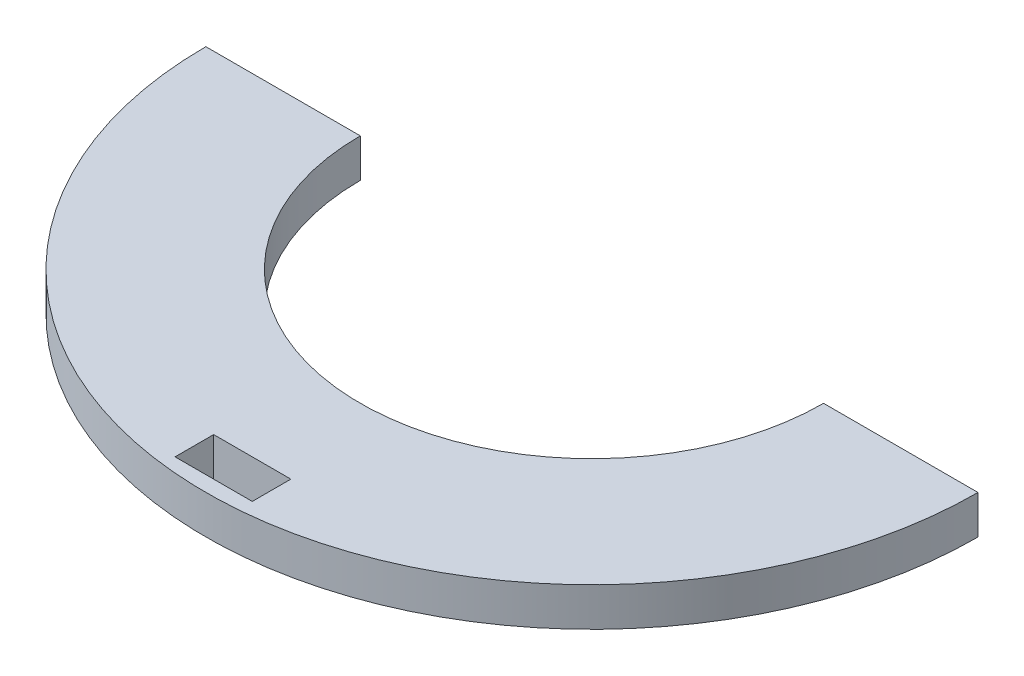
ISO-10303-21;
HEADER;
FILE_DESCRIPTION(('STEP AP214'),'2;1');
FILE_NAME('part.step','',(''),(''),'','','');
FILE_SCHEMA(('AUTOMOTIVE_DESIGN { 1 0 10303 214 1 1 1 1 }'));
ENDSEC;
DATA;
#1=APPLICATION_CONTEXT('core data for automotive mechanical design processes');
#2=APPLICATION_PROTOCOL_DEFINITION('international standard','automotive_design',2000,#1);
#3=PRODUCT_CONTEXT('',#1,'mechanical');
#4=PRODUCT('Part','Part','',(#3));
#5=PRODUCT_RELATED_PRODUCT_CATEGORY('part','',(#4));
#6=PRODUCT_DEFINITION_FORMATION('','',#4);
#7=PRODUCT_DEFINITION_CONTEXT('part definition',#1,'design');
#8=PRODUCT_DEFINITION('design','',#6,#7);
#9=PRODUCT_DEFINITION_SHAPE('','',#8);
#10=(LENGTH_UNIT() NAMED_UNIT(*) SI_UNIT(.MILLI.,.METRE.));
#11=(NAMED_UNIT(*) PLANE_ANGLE_UNIT() SI_UNIT($,.RADIAN.));
#12=(NAMED_UNIT(*) SI_UNIT($,.STERADIAN.) SOLID_ANGLE_UNIT());
#13=UNCERTAINTY_MEASURE_WITH_UNIT(LENGTH_MEASURE(1.E-05),#10,'distance_accuracy_value','');
#14=(GEOMETRIC_REPRESENTATION_CONTEXT(3) GLOBAL_UNCERTAINTY_ASSIGNED_CONTEXT((#13)) GLOBAL_UNIT_ASSIGNED_CONTEXT((#10,
#11,#12)) REPRESENTATION_CONTEXT('',''));
#15=CARTESIAN_POINT('',(0.,0.,0.));
#16=DIRECTION('',(0.,0.,1.));
#17=DIRECTION('',(1.,0.,0.));
#18=AXIS2_PLACEMENT_3D('',#15,#16,#17);
#19=CARTESIAN_POINT('',(0.,5.,0.));
#20=DIRECTION('',(0.,-1.,0.));
#21=DIRECTION('',(0.,0.,-1.));
#22=AXIS2_PLACEMENT_3D('',#19,#20,#21);
#23=CYLINDRICAL_SURFACE('',#22,30.);
#24=CARTESIAN_POINT('',(0.,0.,0.));
#25=DIRECTION('',(0.,-1.,0.));
#26=DIRECTION('',(0.,0.,1.));
#27=AXIS2_PLACEMENT_3D('',#24,#25,#26);
#28=CIRCLE('',#27,30.);
#29=CARTESIAN_POINT('',(30.,0.,0.));
#30=VERTEX_POINT('',#29);
#31=CARTESIAN_POINT('',(-30.,0.,0.));
#32=VERTEX_POINT('',#31);
#33=EDGE_CURVE('E127',#30,#32,#28,.T.);
#34=ORIENTED_EDGE('',*,*,#33,.T.);
#35=DIRECTION('',(0.,-1.,0.));
#36=VECTOR('',#35,1.);
#37=CARTESIAN_POINT('',(-30.,5.,0.));
#38=LINE('',#37,#36);
#39=CARTESIAN_POINT('',(-30.,5.,0.));
#40=VERTEX_POINT('',#39);
#41=EDGE_CURVE('E156',#40,#32,#38,.T.);
#42=ORIENTED_EDGE('',*,*,#41,.F.);
#43=CARTESIAN_POINT('',(0.,5.,0.));
#44=DIRECTION('',(0.,-1.,0.));
#45=DIRECTION('',(0.,0.,1.));
#46=AXIS2_PLACEMENT_3D('',#43,#44,#45);
#47=CIRCLE('',#46,30.);
#48=CARTESIAN_POINT('',(30.,5.,0.));
#49=VERTEX_POINT('',#48);
#50=EDGE_CURVE('E130',#49,#40,#47,.T.);
#51=ORIENTED_EDGE('',*,*,#50,.F.);
#52=DIRECTION('',(0.,-1.,0.));
#53=VECTOR('',#52,1.);
#54=CARTESIAN_POINT('',(30.,5.,0.));
#55=LINE('',#54,#53);
#56=EDGE_CURVE('E140',#49,#30,#55,.T.);
#57=ORIENTED_EDGE('',*,*,#56,.T.);
#58=EDGE_LOOP('',(#34,#42,#51,#57));
#59=FACE_BOUND('',#58,.T.);
#60=ADVANCED_FACE('F37',(#59),#23,.F.);
#61=CARTESIAN_POINT('',(-30.,5.,0.));
#62=DIRECTION('',(0.,0.,1.));
#63=DIRECTION('',(1.,0.,0.));
#64=AXIS2_PLACEMENT_3D('',#61,#62,#63);
#65=PLANE('',#64);
#66=DIRECTION('',(-1.,0.,0.));
#67=VECTOR('',#66,1.);
#68=CARTESIAN_POINT('',(-30.,0.,0.));
#69=LINE('',#68,#67);
#70=CARTESIAN_POINT('',(-50.,0.,0.));
#71=VERTEX_POINT('',#70);
#72=EDGE_CURVE('E143',#32,#71,#69,.T.);
#73=ORIENTED_EDGE('',*,*,#72,.T.);
#74=DIRECTION('',(0.,-1.,0.));
#75=VECTOR('',#74,1.);
#76=CARTESIAN_POINT('',(-50.,5.,0.));
#77=LINE('',#76,#75);
#78=CARTESIAN_POINT('',(-50.,5.,0.));
#79=VERTEX_POINT('',#78);
#80=EDGE_CURVE('E153',#79,#71,#77,.T.);
#81=ORIENTED_EDGE('',*,*,#80,.F.);
#82=DIRECTION('',(-1.,0.,0.));
#83=VECTOR('',#82,1.);
#84=CARTESIAN_POINT('',(-30.,5.,0.));
#85=LINE('',#84,#83);
#86=EDGE_CURVE('E133',#40,#79,#85,.T.);
#87=ORIENTED_EDGE('',*,*,#86,.F.);
#88=ORIENTED_EDGE('',*,*,#41,.T.);
#89=EDGE_LOOP('',(#73,#81,#87,#88));
#90=FACE_BOUND('',#89,.T.);
#91=ADVANCED_FACE('F180',(#90),#65,.F.);
#92=CARTESIAN_POINT('',(0.,5.,0.));
#93=DIRECTION('',(0.,-1.,0.));
#94=DIRECTION('',(0.,0.,-1.));
#95=AXIS2_PLACEMENT_3D('',#92,#93,#94);
#96=CYLINDRICAL_SURFACE('',#95,50.);
#97=CARTESIAN_POINT('',(0.,0.,0.));
#98=DIRECTION('',(0.,1.,0.));
#99=DIRECTION('',(0.,0.,1.));
#100=AXIS2_PLACEMENT_3D('',#97,#98,#99);
#101=CIRCLE('',#100,50.);
#102=CARTESIAN_POINT('',(50.,0.,0.));
#103=VERTEX_POINT('',#102);
#104=EDGE_CURVE('E145',#71,#103,#101,.T.);
#105=ORIENTED_EDGE('',*,*,#104,.T.);
#106=DIRECTION('',(0.,-1.,0.));
#107=VECTOR('',#106,1.);
#108=CARTESIAN_POINT('',(50.,5.,0.));
#109=LINE('',#108,#107);
#110=CARTESIAN_POINT('',(50.,5.,0.));
#111=VERTEX_POINT('',#110);
#112=EDGE_CURVE('E150',#111,#103,#109,.T.);
#113=ORIENTED_EDGE('',*,*,#112,.F.);
#114=CARTESIAN_POINT('',(0.,5.,0.));
#115=DIRECTION('',(0.,1.,0.));
#116=DIRECTION('',(0.,0.,1.));
#117=AXIS2_PLACEMENT_3D('',#114,#115,#116);
#118=CIRCLE('',#117,50.);
#119=EDGE_CURVE('E136',#79,#111,#118,.T.);
#120=ORIENTED_EDGE('',*,*,#119,.F.);
#121=ORIENTED_EDGE('',*,*,#80,.T.);
#122=EDGE_LOOP('',(#105,#113,#120,#121));
#123=FACE_BOUND('',#122,.T.);
#124=ADVANCED_FACE('F185',(#123),#96,.T.);
#125=CARTESIAN_POINT('',(30.,5.,0.));
#126=DIRECTION('',(0.,0.,1.));
#127=DIRECTION('',(1.,0.,0.));
#128=AXIS2_PLACEMENT_3D('',#125,#126,#127);
#129=PLANE('',#128);
#130=DIRECTION('',(-1.,0.,0.));
#131=VECTOR('',#130,1.);
#132=CARTESIAN_POINT('',(30.,0.,0.));
#133=LINE('',#132,#131);
#134=EDGE_CURVE('E134',#103,#30,#133,.T.);
#135=ORIENTED_EDGE('',*,*,#134,.T.);
#136=ORIENTED_EDGE('',*,*,#56,.F.);
#137=DIRECTION('',(-1.,0.,0.));
#138=VECTOR('',#137,1.);
#139=CARTESIAN_POINT('',(30.,5.,0.));
#140=LINE('',#139,#138);
#141=EDGE_CURVE('E138',#111,#49,#140,.T.);
#142=ORIENTED_EDGE('',*,*,#141,.F.);
#143=ORIENTED_EDGE('',*,*,#112,.T.);
#144=EDGE_LOOP('',(#135,#136,#142,#143));
#145=FACE_BOUND('',#144,.T.);
#146=ADVANCED_FACE('F198',(#145),#129,.F.);
#147=CARTESIAN_POINT('',(0.,5.,0.));
#148=DIRECTION('',(0.,1.,0.));
#149=DIRECTION('',(0.,0.,1.));
#150=AXIS2_PLACEMENT_3D('',#147,#148,#149);
#151=PLANE('',#150);
#152=DIRECTION('',(0.,0.,-1.));
#153=VECTOR('',#152,1.);
#154=CARTESIAN_POINT('',(4.00991710969123,5.,48.));
#155=LINE('',#154,#153);
#156=CARTESIAN_POINT('',(4.00991710969123,5.,48.));
#157=VERTEX_POINT('',#156);
#158=CARTESIAN_POINT('',(4.00991710969123,5.,43.));
#159=VERTEX_POINT('',#158);
#160=EDGE_CURVE('E51',#157,#159,#155,.T.);
#161=ORIENTED_EDGE('',*,*,#160,.F.);
#162=DIRECTION('',(1.,0.,0.));
#163=VECTOR('',#162,1.);
#164=CARTESIAN_POINT('',(-5.99008289030877,5.,48.));
#165=LINE('',#164,#163);
#166=CARTESIAN_POINT('',(-5.99008289030877,5.,48.));
#167=VERTEX_POINT('',#166);
#168=EDGE_CURVE('E120',#167,#157,#165,.T.);
#169=ORIENTED_EDGE('',*,*,#168,.F.);
#170=DIRECTION('',(0.,0.,1.));
#171=VECTOR('',#170,1.);
#172=CARTESIAN_POINT('',(-5.99008289030877,5.,48.));
#173=LINE('',#172,#171);
#174=CARTESIAN_POINT('',(-5.99008289030877,5.,43.));
#175=VERTEX_POINT('',#174);
#176=EDGE_CURVE('E104',#175,#167,#173,.T.);
#177=ORIENTED_EDGE('',*,*,#176,.F.);
#178=DIRECTION('',(-1.,0.,0.));
#179=VECTOR('',#178,1.);
#180=CARTESIAN_POINT('',(-5.99008289030877,5.,43.));
#181=LINE('',#180,#179);
#182=EDGE_CURVE('E113',#159,#175,#181,.T.);
#183=ORIENTED_EDGE('',*,*,#182,.F.);
#184=EDGE_LOOP('',(#161,#169,#177,#183));
#185=FACE_BOUND('',#184,.T.);
#186=ORIENTED_EDGE('',*,*,#50,.T.);
#187=ORIENTED_EDGE('',*,*,#86,.T.);
#188=ORIENTED_EDGE('',*,*,#119,.T.);
#189=ORIENTED_EDGE('',*,*,#141,.T.);
#190=EDGE_LOOP('',(#186,#187,#188,#189));
#191=FACE_BOUND('',#190,.T.);
#192=ADVANCED_FACE('F117',(#185,#191),#151,.T.);
#193=CARTESIAN_POINT('',(0.,0.,0.));
#194=DIRECTION('',(0.,1.,0.));
#195=DIRECTION('',(0.,0.,1.));
#196=AXIS2_PLACEMENT_3D('',#193,#194,#195);
#197=PLANE('',#196);
#198=DIRECTION('',(1.,0.,0.));
#199=VECTOR('',#198,1.);
#200=CARTESIAN_POINT('',(0.,0.,48.));
#201=LINE('',#200,#199);
#202=CARTESIAN_POINT('',(-5.99008289030877,0.,48.));
#203=VERTEX_POINT('',#202);
#204=CARTESIAN_POINT('',(4.00991710969123,0.,48.));
#205=VERTEX_POINT('',#204);
#206=EDGE_CURVE('E44',#203,#205,#201,.T.);
#207=ORIENTED_EDGE('',*,*,#206,.T.);
#208=DIRECTION('',(0.,0.,-1.));
#209=VECTOR('',#208,1.);
#210=CARTESIAN_POINT('',(4.00991710969123,0.,0.));
#211=LINE('',#210,#209);
#212=CARTESIAN_POINT('',(4.00991710969123,0.,43.));
#213=VERTEX_POINT('',#212);
#214=EDGE_CURVE('E11',#205,#213,#211,.T.);
#215=ORIENTED_EDGE('',*,*,#214,.T.);
#216=DIRECTION('',(-1.,0.,0.));
#217=VECTOR('',#216,1.);
#218=CARTESIAN_POINT('',(0.,0.,43.));
#219=LINE('',#218,#217);
#220=CARTESIAN_POINT('',(-5.99008289030877,0.,43.));
#221=VERTEX_POINT('',#220);
#222=EDGE_CURVE('E159',#213,#221,#219,.T.);
#223=ORIENTED_EDGE('',*,*,#222,.T.);
#224=DIRECTION('',(0.,0.,1.));
#225=VECTOR('',#224,1.);
#226=CARTESIAN_POINT('',(-5.99008289030877,0.,0.));
#227=LINE('',#226,#225);
#228=EDGE_CURVE('E107',#221,#203,#227,.T.);
#229=ORIENTED_EDGE('',*,*,#228,.T.);
#230=EDGE_LOOP('',(#207,#215,#223,#229));
#231=FACE_BOUND('',#230,.T.);
#232=ORIENTED_EDGE('',*,*,#33,.F.);
#233=ORIENTED_EDGE('',*,*,#134,.F.);
#234=ORIENTED_EDGE('',*,*,#104,.F.);
#235=ORIENTED_EDGE('',*,*,#72,.F.);
#236=EDGE_LOOP('',(#232,#233,#234,#235));
#237=FACE_BOUND('',#236,.T.);
#238=ADVANCED_FACE('F163',(#231,#237),#197,.F.);
#239=CARTESIAN_POINT('',(4.00991710969123,-5.,48.));
#240=DIRECTION('',(1.,0.,0.));
#241=DIRECTION('',(0.,0.,-1.));
#242=AXIS2_PLACEMENT_3D('',#239,#240,#241);
#243=PLANE('',#242);
#244=DIRECTION('',(0.,1.,0.));
#245=VECTOR('',#244,1.);
#246=CARTESIAN_POINT('',(4.00991710969123,-5.,48.));
#247=LINE('',#246,#245);
#248=EDGE_CURVE('E125',#205,#157,#247,.T.);
#249=ORIENTED_EDGE('',*,*,#248,.T.);
#250=ORIENTED_EDGE('',*,*,#160,.T.);
#251=DIRECTION('',(0.,1.,0.));
#252=VECTOR('',#251,1.);
#253=CARTESIAN_POINT('',(4.00991710969123,-5.,43.));
#254=LINE('',#253,#252);
#255=EDGE_CURVE('E110',#213,#159,#254,.T.);
#256=ORIENTED_EDGE('',*,*,#255,.F.);
#257=ORIENTED_EDGE('',*,*,#214,.F.);
#258=EDGE_LOOP('',(#249,#250,#256,#257));
#259=FACE_BOUND('',#258,.T.);
#260=ADVANCED_FACE('F168',(#259),#243,.F.);
#261=CARTESIAN_POINT('',(-5.99008289030877,-5.,48.));
#262=DIRECTION('',(0.,0.,1.));
#263=DIRECTION('',(1.,0.,0.));
#264=AXIS2_PLACEMENT_3D('',#261,#262,#263);
#265=PLANE('',#264);
#266=DIRECTION('',(0.,1.,0.));
#267=VECTOR('',#266,1.);
#268=CARTESIAN_POINT('',(-5.99008289030877,-5.,48.));
#269=LINE('',#268,#267);
#270=EDGE_CURVE('E109',#203,#167,#269,.T.);
#271=ORIENTED_EDGE('',*,*,#270,.T.);
#272=ORIENTED_EDGE('',*,*,#168,.T.);
#273=ORIENTED_EDGE('',*,*,#248,.F.);
#274=ORIENTED_EDGE('',*,*,#206,.F.);
#275=EDGE_LOOP('',(#271,#272,#273,#274));
#276=FACE_BOUND('',#275,.T.);
#277=ADVANCED_FACE('F167',(#276),#265,.F.);
#278=CARTESIAN_POINT('',(-5.99008289030877,-5.,48.));
#279=DIRECTION('',(-1.,0.,0.));
#280=DIRECTION('',(0.,0.,1.));
#281=AXIS2_PLACEMENT_3D('',#278,#279,#280);
#282=PLANE('',#281);
#283=DIRECTION('',(0.,1.,0.));
#284=VECTOR('',#283,1.);
#285=CARTESIAN_POINT('',(-5.99008289030877,-5.,43.));
#286=LINE('',#285,#284);
#287=EDGE_CURVE('E59',#221,#175,#286,.T.);
#288=ORIENTED_EDGE('',*,*,#287,.T.);
#289=ORIENTED_EDGE('',*,*,#176,.T.);
#290=ORIENTED_EDGE('',*,*,#270,.F.);
#291=ORIENTED_EDGE('',*,*,#228,.F.);
#292=EDGE_LOOP('',(#288,#289,#290,#291));
#293=FACE_BOUND('',#292,.T.);
#294=ADVANCED_FACE('F101',(#293),#282,.F.);
#295=CARTESIAN_POINT('',(-5.99008289030877,-5.,43.));
#296=DIRECTION('',(0.,0.,-1.));
#297=DIRECTION('',(-1.,0.,0.));
#298=AXIS2_PLACEMENT_3D('',#295,#296,#297);
#299=PLANE('',#298);
#300=ORIENTED_EDGE('',*,*,#255,.T.);
#301=ORIENTED_EDGE('',*,*,#182,.T.);
#302=ORIENTED_EDGE('',*,*,#287,.F.);
#303=ORIENTED_EDGE('',*,*,#222,.F.);
#304=EDGE_LOOP('',(#300,#301,#302,#303));
#305=FACE_BOUND('',#304,.T.);
#306=ADVANCED_FACE('F114',(#305),#299,.F.);
#307=CLOSED_SHELL('',(#60,#91,#124,#146,#192,#238,#260,#277,#294,#306));
#308=MANIFOLD_SOLID_BREP('B2',#307);
#309=ADVANCED_BREP_SHAPE_REPRESENTATION('',(#18,#308),#14);
#310=SHAPE_DEFINITION_REPRESENTATION(#9,#309);
ENDSEC;
END-ISO-10303-21;
